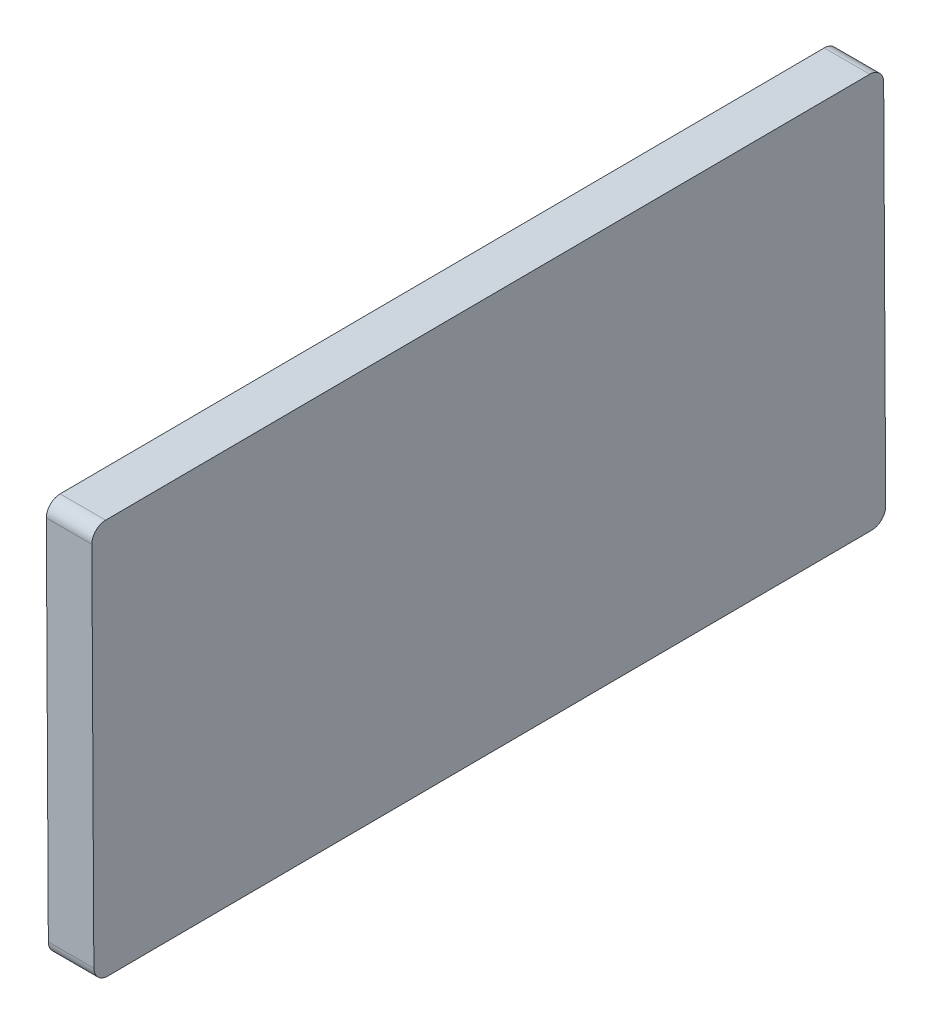
ISO-10303-21;
HEADER;
FILE_DESCRIPTION(('STEP AP214'),'2;1');
FILE_NAME('part.step','',(''),(''),'','','');
FILE_SCHEMA(('AUTOMOTIVE_DESIGN { 1 0 10303 214 1 1 1 1 }'));
ENDSEC;
DATA;
#1=APPLICATION_CONTEXT('core data for automotive mechanical design processes');
#2=APPLICATION_PROTOCOL_DEFINITION('international standard','automotive_design',2000,#1);
#3=PRODUCT_CONTEXT('',#1,'mechanical');
#4=PRODUCT('Part','Part','',(#3));
#5=PRODUCT_RELATED_PRODUCT_CATEGORY('part','',(#4));
#6=PRODUCT_DEFINITION_FORMATION('','',#4);
#7=PRODUCT_DEFINITION_CONTEXT('part definition',#1,'design');
#8=PRODUCT_DEFINITION('design','',#6,#7);
#9=PRODUCT_DEFINITION_SHAPE('','',#8);
#10=(LENGTH_UNIT() NAMED_UNIT(*) SI_UNIT(.MILLI.,.METRE.));
#11=(NAMED_UNIT(*) PLANE_ANGLE_UNIT() SI_UNIT($,.RADIAN.));
#12=(NAMED_UNIT(*) SI_UNIT($,.STERADIAN.) SOLID_ANGLE_UNIT());
#13=UNCERTAINTY_MEASURE_WITH_UNIT(LENGTH_MEASURE(1.E-05),#10,'distance_accuracy_value','');
#14=(GEOMETRIC_REPRESENTATION_CONTEXT(3) GLOBAL_UNCERTAINTY_ASSIGNED_CONTEXT((#13)) GLOBAL_UNIT_ASSIGNED_CONTEXT((#10,
#11,#12)) REPRESENTATION_CONTEXT('',''));
#15=CARTESIAN_POINT('',(0.,0.,0.));
#16=DIRECTION('',(0.,0.,1.));
#17=DIRECTION('',(1.,0.,0.));
#18=AXIS2_PLACEMENT_3D('',#15,#16,#17);
#19=CARTESIAN_POINT('',(4.50004999998,27.55105558578,10.52951353575));
#20=DIRECTION('',(1.,0.,0.));
#21=DIRECTION('',(0.,1.,0.));
#22=AXIS2_PLACEMENT_3D('',#19,#20,#21);
#23=PLANE('',#22);
#24=DIRECTION('',(0.,-0.005424275513577,0.999985288509362));
#25=VECTOR('',#24,1.);
#26=CARTESIAN_POINT('',(4.50004999998,17.6558912180984,-8.82444528761647));
#27=LINE('',#26,#25);
#28=CARTESIAN_POINT('',(4.50004999998,17.6558912180984,-8.82444528761647));
#29=VERTEX_POINT('',#28);
#30=CARTESIAN_POINT('',(4.50004999998,17.4465141832743,29.774986848845));
#31=VERTEX_POINT('',#30);
#32=EDGE_CURVE('E115',#29,#31,#27,.T.);
#33=ORIENTED_EDGE('',*,*,#32,.F.);
#34=CARTESIAN_POINT('',(4.50004999998,18.355880920055,-8.82064829475696));
#35=DIRECTION('',(-1.,0.,0.));
#36=DIRECTION('',(0.,0.00542427551357614,-0.999985288509362));
#37=AXIS2_PLACEMENT_3D('',#34,#35,#36);
#38=CIRCLE('',#37,0.7);
#39=CARTESIAN_POINT('',(4.50004999998,18.3596779129144,-9.52063799671352));
#40=VERTEX_POINT('',#39);
#41=EDGE_CURVE('E142',#40,#29,#38,.T.);
#42=ORIENTED_EDGE('',*,*,#41,.F.);
#43=DIRECTION('',(0.,-0.999985288509362,-0.005424275513577));
#44=VECTOR('',#43,1.);
#45=CARTESIAN_POINT('',(4.50004999998,36.9594042791886,-9.41974647216098));
#46=LINE('',#45,#44);
#47=CARTESIAN_POINT('',(4.50004999998,36.9594042791886,-9.41974647216098));
#48=VERTEX_POINT('',#47);
#49=EDGE_CURVE('E156',#48,#40,#46,.T.);
#50=ORIENTED_EDGE('',*,*,#49,.F.);
#51=CARTESIAN_POINT('',(4.50004999998,36.9556072863291,-8.71975677020443));
#52=DIRECTION('',(-1.,0.,0.));
#53=DIRECTION('',(0.,0.999985288509362,0.00542427551357614));
#54=AXIS2_PLACEMENT_3D('',#51,#52,#53);
#55=CIRCLE('',#54,0.7);
#56=CARTESIAN_POINT('',(4.50004999998,37.6555969882856,-8.71595977734493));
#57=VERTEX_POINT('',#56);
#58=EDGE_CURVE('E165',#57,#48,#55,.T.);
#59=ORIENTED_EDGE('',*,*,#58,.F.);
#60=DIRECTION('',(0.,0.005424275513577,-0.999985288509362));
#61=VECTOR('',#60,1.);
#62=CARTESIAN_POINT('',(4.50004999998,37.4462199534616,29.8834723591164));
#63=LINE('',#62,#61);
#64=CARTESIAN_POINT('',(4.50004999998,37.4462199534616,29.8834723591164));
#65=VERTEX_POINT('',#64);
#66=EDGE_CURVE('E164',#65,#57,#63,.T.);
#67=ORIENTED_EDGE('',*,*,#66,.F.);
#68=CARTESIAN_POINT('',(4.50004999998,36.7462302515051,29.879675366257));
#69=DIRECTION('',(-1.,0.,0.));
#70=DIRECTION('',(0.,-0.00542427551357614,0.999985288509362));
#71=AXIS2_PLACEMENT_3D('',#68,#69,#70);
#72=CIRCLE('',#71,0.7);
#73=CARTESIAN_POINT('',(4.50004999998,36.7424332586455,30.5796650682135));
#74=VERTEX_POINT('',#73);
#75=EDGE_CURVE('E25',#74,#65,#72,.T.);
#76=ORIENTED_EDGE('',*,*,#75,.F.);
#77=DIRECTION('',(0.,0.999985288509362,0.005424275513577));
#78=VECTOR('',#77,1.);
#79=CARTESIAN_POINT('',(4.50004999998,18.1427068923714,30.478773543661));
#80=LINE('',#79,#78);
#81=CARTESIAN_POINT('',(4.50004999998,18.1427068923714,30.478773543661));
#82=VERTEX_POINT('',#81);
#83=EDGE_CURVE('E11',#82,#74,#80,.T.);
#84=ORIENTED_EDGE('',*,*,#83,.F.);
#85=CARTESIAN_POINT('',(4.50004999998,18.1465038852309,29.7787838417044));
#86=DIRECTION('',(-1.,0.,0.));
#87=DIRECTION('',(0.,-0.999985288509362,-0.00542427551357614));
#88=AXIS2_PLACEMENT_3D('',#85,#86,#87);
#89=CIRCLE('',#88,0.7);
#90=EDGE_CURVE('E117',#31,#82,#89,.T.);
#91=ORIENTED_EDGE('',*,*,#90,.F.);
#92=EDGE_LOOP('',(#33,#42,#50,#59,#67,#76,#84,#91));
#93=FACE_BOUND('',#92,.T.);
#94=ADVANCED_FACE('F17',(#93),#23,.T.);
#95=CARTESIAN_POINT('',(6.30004999998,18.742698065477,30.4820281089691));
#96=DIRECTION('',(0.,0.005424275513577,-0.999985288509362));
#97=DIRECTION('',(-1.,0.,0.));
#98=AXIS2_PLACEMENT_3D('',#95,#96,#97);
#99=PLANE('',#98);
#100=ORIENTED_EDGE('',*,*,#83,.T.);
#101=DIRECTION('',(-1.,0.,0.));
#102=VECTOR('',#101,1.);
#103=CARTESIAN_POINT('',(4.50004999998,36.7424332586455,30.5796650682135));
#104=LINE('',#103,#102);
#105=CARTESIAN_POINT('',(2.20004999998,36.7424332586455,30.5796650682135));
#106=VERTEX_POINT('',#105);
#107=EDGE_CURVE('E171',#74,#106,#104,.T.);
#108=ORIENTED_EDGE('',*,*,#107,.T.);
#109=DIRECTION('',(0.,-0.999985288509362,-0.005424275513577));
#110=VECTOR('',#109,1.);
#111=CARTESIAN_POINT('',(2.20004999998,36.7424332586455,30.5796650682135));
#112=LINE('',#111,#110);
#113=CARTESIAN_POINT('',(2.20004999998,18.1427068923714,30.478773543661));
#114=VERTEX_POINT('',#113);
#115=EDGE_CURVE('E411',#106,#114,#112,.T.);
#116=ORIENTED_EDGE('',*,*,#115,.T.);
#117=DIRECTION('',(1.,0.,0.));
#118=VECTOR('',#117,1.);
#119=CARTESIAN_POINT('',(2.20004999998,18.1427068923714,30.478773543661));
#120=LINE('',#119,#118);
#121=EDGE_CURVE('E119',#114,#82,#120,.T.);
#122=ORIENTED_EDGE('',*,*,#121,.T.);
#123=EDGE_LOOP('',(#100,#108,#116,#122));
#124=FACE_BOUND('',#123,.T.);
#125=ADVANCED_FACE('F262',(#124),#99,.F.);
#126=CARTESIAN_POINT('',(2.12981956025994,36.7462302515051,29.879675366257));
#127=DIRECTION('',(1.,0.,0.));
#128=DIRECTION('',(0.,0.999985288509362,0.00542427551357614));
#129=AXIS2_PLACEMENT_3D('',#126,#127,#128);
#130=CYLINDRICAL_SURFACE('',#129,0.7);
#131=DIRECTION('',(1.,0.,0.));
#132=VECTOR('',#131,1.);
#133=CARTESIAN_POINT('',(2.20004999998,37.4462199534616,29.8834723591164));
#134=LINE('',#133,#132);
#135=CARTESIAN_POINT('',(2.20004999998,37.4462199534616,29.8834723591164));
#136=VERTEX_POINT('',#135);
#137=EDGE_CURVE('E169',#136,#65,#134,.T.);
#138=ORIENTED_EDGE('',*,*,#137,.F.);
#139=CARTESIAN_POINT('',(2.20004999998,36.7462302515051,29.879675366257));
#140=DIRECTION('',(1.,0.,0.));
#141=DIRECTION('',(0.,0.999985288509362,0.00542427551357614));
#142=AXIS2_PLACEMENT_3D('',#139,#140,#141);
#143=CIRCLE('',#142,0.7);
#144=EDGE_CURVE('E414',#136,#106,#143,.T.);
#145=ORIENTED_EDGE('',*,*,#144,.T.);
#146=ORIENTED_EDGE('',*,*,#107,.F.);
#147=ORIENTED_EDGE('',*,*,#75,.T.);
#148=EDGE_LOOP('',(#138,#145,#146,#147));
#149=FACE_BOUND('',#148,.T.);
#150=ADVANCED_FACE('F193',(#149),#130,.T.);
#151=CARTESIAN_POINT('',(6.30004999998,37.6523424229775,-8.11596860423931));
#152=DIRECTION('',(0.,-0.999985288509362,-0.005424275513577));
#153=DIRECTION('',(0.,0.005424275513577,-0.999985288509362));
#154=AXIS2_PLACEMENT_3D('',#151,#152,#153);
#155=PLANE('',#154);
#156=ORIENTED_EDGE('',*,*,#66,.T.);
#157=DIRECTION('',(-1.,0.,0.));
#158=VECTOR('',#157,1.);
#159=CARTESIAN_POINT('',(4.50004999998,37.6555969882856,-8.71595977734493));
#160=LINE('',#159,#158);
#161=CARTESIAN_POINT('',(2.20004999998,37.6555969882856,-8.71595977734493));
#162=VERTEX_POINT('',#161);
#163=EDGE_CURVE('E157',#57,#162,#160,.T.);
#164=ORIENTED_EDGE('',*,*,#163,.T.);
#165=DIRECTION('',(0.,-0.005424275513577,0.999985288509362));
#166=VECTOR('',#165,1.);
#167=CARTESIAN_POINT('',(2.20004999998,37.6555969882856,-8.71595977734493));
#168=LINE('',#167,#166);
#169=EDGE_CURVE('E404',#162,#136,#168,.T.);
#170=ORIENTED_EDGE('',*,*,#169,.T.);
#171=ORIENTED_EDGE('',*,*,#137,.T.);
#172=EDGE_LOOP('',(#156,#164,#170,#171));
#173=FACE_BOUND('',#172,.T.);
#174=ADVANCED_FACE('F190',(#173),#155,.F.);
#175=CARTESIAN_POINT('',(2.13778314557076,36.9556072863291,-8.71975677020443));
#176=DIRECTION('',(1.,0.,0.));
#177=DIRECTION('',(0.,0.00542427551357614,-0.999985288509362));
#178=AXIS2_PLACEMENT_3D('',#175,#176,#177);
#179=CYLINDRICAL_SURFACE('',#178,0.7);
#180=DIRECTION('',(1.,0.,0.));
#181=VECTOR('',#180,1.);
#182=CARTESIAN_POINT('',(2.20004999998,36.9594042791886,-9.41974647216098));
#183=LINE('',#182,#181);
#184=CARTESIAN_POINT('',(2.20004999998,36.9594042791886,-9.41974647216098));
#185=VERTEX_POINT('',#184);
#186=EDGE_CURVE('E141',#185,#48,#183,.T.);
#187=ORIENTED_EDGE('',*,*,#186,.F.);
#188=CARTESIAN_POINT('',(2.20004999998,36.9556072863291,-8.71975677020443));
#189=DIRECTION('',(1.,0.,0.));
#190=DIRECTION('',(0.,0.00542427551357614,-0.999985288509362));
#191=AXIS2_PLACEMENT_3D('',#188,#189,#190);
#192=CIRCLE('',#191,0.7);
#193=EDGE_CURVE('E410',#185,#162,#192,.T.);
#194=ORIENTED_EDGE('',*,*,#193,.T.);
#195=ORIENTED_EDGE('',*,*,#163,.F.);
#196=ORIENTED_EDGE('',*,*,#58,.T.);
#197=EDGE_LOOP('',(#187,#194,#195,#196));
#198=FACE_BOUND('',#197,.T.);
#199=ADVANCED_FACE('F195',(#198),#179,.T.);
#200=CARTESIAN_POINT('',(6.30004999998,18.9596690860201,-9.51738343140537));
#201=DIRECTION('',(0.,-0.005424275513577,0.999985288509362));
#202=DIRECTION('',(-1.,0.,0.));
#203=AXIS2_PLACEMENT_3D('',#200,#201,#202);
#204=PLANE('',#203);
#205=DIRECTION('',(0.,-0.999985288509362,-0.005424275513577));
#206=VECTOR('',#205,1.);
#207=CARTESIAN_POINT('',(2.20004999998,36.9594042791886,-9.41974647216098));
#208=LINE('',#207,#206);
#209=CARTESIAN_POINT('',(2.20004999998,18.3596779129144,-9.52063799671352));
#210=VERTEX_POINT('',#209);
#211=EDGE_CURVE('E138',#185,#210,#208,.T.);
#212=ORIENTED_EDGE('',*,*,#211,.F.);
#213=ORIENTED_EDGE('',*,*,#186,.T.);
#214=ORIENTED_EDGE('',*,*,#49,.T.);
#215=DIRECTION('',(-1.,0.,0.));
#216=VECTOR('',#215,1.);
#217=CARTESIAN_POINT('',(4.50004999998,18.3596779129144,-9.52063799671352));
#218=LINE('',#217,#216);
#219=EDGE_CURVE('E145',#40,#210,#218,.T.);
#220=ORIENTED_EDGE('',*,*,#219,.T.);
#221=EDGE_LOOP('',(#212,#213,#214,#220));
#222=FACE_BOUND('',#221,.T.);
#223=ADVANCED_FACE('F234',(#222),#204,.F.);
#224=CARTESIAN_POINT('',(2.13778314557076,18.355880920055,-8.82064829475696));
#225=DIRECTION('',(1.,0.,0.));
#226=DIRECTION('',(0.,-0.999985288509362,-0.00542427551357614));
#227=AXIS2_PLACEMENT_3D('',#224,#225,#226);
#228=CYLINDRICAL_SURFACE('',#227,0.7);
#229=DIRECTION('',(1.,0.,0.));
#230=VECTOR('',#229,1.);
#231=CARTESIAN_POINT('',(2.20004999998,17.6558912180984,-8.82444528761647));
#232=LINE('',#231,#230);
#233=CARTESIAN_POINT('',(2.20004999998,17.6558912180984,-8.82444528761647));
#234=VERTEX_POINT('',#233);
#235=EDGE_CURVE('E146',#234,#29,#232,.T.);
#236=ORIENTED_EDGE('',*,*,#235,.F.);
#237=CARTESIAN_POINT('',(2.20004999998,18.355880920055,-8.82064829475696));
#238=DIRECTION('',(1.,0.,0.));
#239=DIRECTION('',(0.,-0.999985288509362,-0.00542427551357614));
#240=AXIS2_PLACEMENT_3D('',#237,#238,#239);
#241=CIRCLE('',#240,0.7);
#242=EDGE_CURVE('E131',#234,#210,#241,.T.);
#243=ORIENTED_EDGE('',*,*,#242,.T.);
#244=ORIENTED_EDGE('',*,*,#219,.F.);
#245=ORIENTED_EDGE('',*,*,#41,.T.);
#246=EDGE_LOOP('',(#236,#243,#244,#245));
#247=FACE_BOUND('',#246,.T.);
#248=ADVANCED_FACE('F223',(#247),#228,.T.);
#249=CARTESIAN_POINT('',(6.30004999998,17.6526366527903,-8.22445411451085));
#250=DIRECTION('',(0.,0.999985288509362,0.005424275513577));
#251=DIRECTION('',(1.,0.,0.));
#252=AXIS2_PLACEMENT_3D('',#249,#250,#251);
#253=PLANE('',#252);
#254=DIRECTION('',(0.,0.005424275513577,-0.999985288509362));
#255=VECTOR('',#254,1.);
#256=CARTESIAN_POINT('',(2.20004999998,17.4465141832743,29.774986848845));
#257=LINE('',#256,#255);
#258=CARTESIAN_POINT('',(2.20004999998,17.4465141832743,29.774986848845));
#259=VERTEX_POINT('',#258);
#260=EDGE_CURVE('E108',#259,#234,#257,.T.);
#261=ORIENTED_EDGE('',*,*,#260,.T.);
#262=ORIENTED_EDGE('',*,*,#235,.T.);
#263=ORIENTED_EDGE('',*,*,#32,.T.);
#264=DIRECTION('',(-1.,0.,0.));
#265=VECTOR('',#264,1.);
#266=CARTESIAN_POINT('',(4.50004999998,17.4465141832743,29.774986848845));
#267=LINE('',#266,#265);
#268=EDGE_CURVE('E102',#31,#259,#267,.T.);
#269=ORIENTED_EDGE('',*,*,#268,.T.);
#270=EDGE_LOOP('',(#261,#262,#263,#269));
#271=FACE_BOUND('',#270,.T.);
#272=ADVANCED_FACE('F106',(#271),#253,.F.);
#273=CARTESIAN_POINT('',(2.12498552426424,18.1465038852309,29.7787838417044));
#274=DIRECTION('',(1.,0.,0.));
#275=DIRECTION('',(0.,-0.00542427551357614,0.999985288509362));
#276=AXIS2_PLACEMENT_3D('',#273,#274,#275);
#277=CYLINDRICAL_SURFACE('',#276,0.7);
#278=ORIENTED_EDGE('',*,*,#121,.F.);
#279=CARTESIAN_POINT('',(2.20004999998,18.1465038852309,29.7787838417044));
#280=DIRECTION('',(1.,0.,0.));
#281=DIRECTION('',(0.,-0.00542427551357614,0.999985288509362));
#282=AXIS2_PLACEMENT_3D('',#279,#280,#281);
#283=CIRCLE('',#282,0.7);
#284=EDGE_CURVE('E121',#114,#259,#283,.T.);
#285=ORIENTED_EDGE('',*,*,#284,.T.);
#286=ORIENTED_EDGE('',*,*,#268,.F.);
#287=ORIENTED_EDGE('',*,*,#90,.T.);
#288=EDGE_LOOP('',(#278,#285,#286,#287));
#289=FACE_BOUND('',#288,.T.);
#290=ADVANCED_FACE('F125',(#289),#277,.T.);
#291=CARTESIAN_POINT('',(2.20004999998,18.9526175278524,-8.2174025563432));
#292=DIRECTION('',(1.,0.,0.));
#293=DIRECTION('',(0.,1.,0.));
#294=AXIS2_PLACEMENT_3D('',#291,#292,#293);
#295=PLANE('',#294);
#296=ORIENTED_EDGE('',*,*,#115,.F.);
#297=ORIENTED_EDGE('',*,*,#144,.F.);
#298=ORIENTED_EDGE('',*,*,#169,.F.);
#299=ORIENTED_EDGE('',*,*,#193,.F.);
#300=ORIENTED_EDGE('',*,*,#211,.T.);
#301=ORIENTED_EDGE('',*,*,#242,.F.);
#302=ORIENTED_EDGE('',*,*,#260,.F.);
#303=ORIENTED_EDGE('',*,*,#284,.F.);
#304=EDGE_LOOP('',(#296,#297,#298,#299,#300,#301,#302,#303));
#305=FACE_BOUND('',#304,.T.);
#306=ADVANCED_FACE('F128',(#305),#295,.F.);
#307=CLOSED_SHELL('',(#94,#125,#150,#174,#199,#223,#248,#272,#290,#306));
#308=MANIFOLD_SOLID_BREP('B1',#307);
#309=ADVANCED_BREP_SHAPE_REPRESENTATION('',(#18,#308),#14);
#310=SHAPE_DEFINITION_REPRESENTATION(#9,#309);
ENDSEC;
END-ISO-10303-21;
